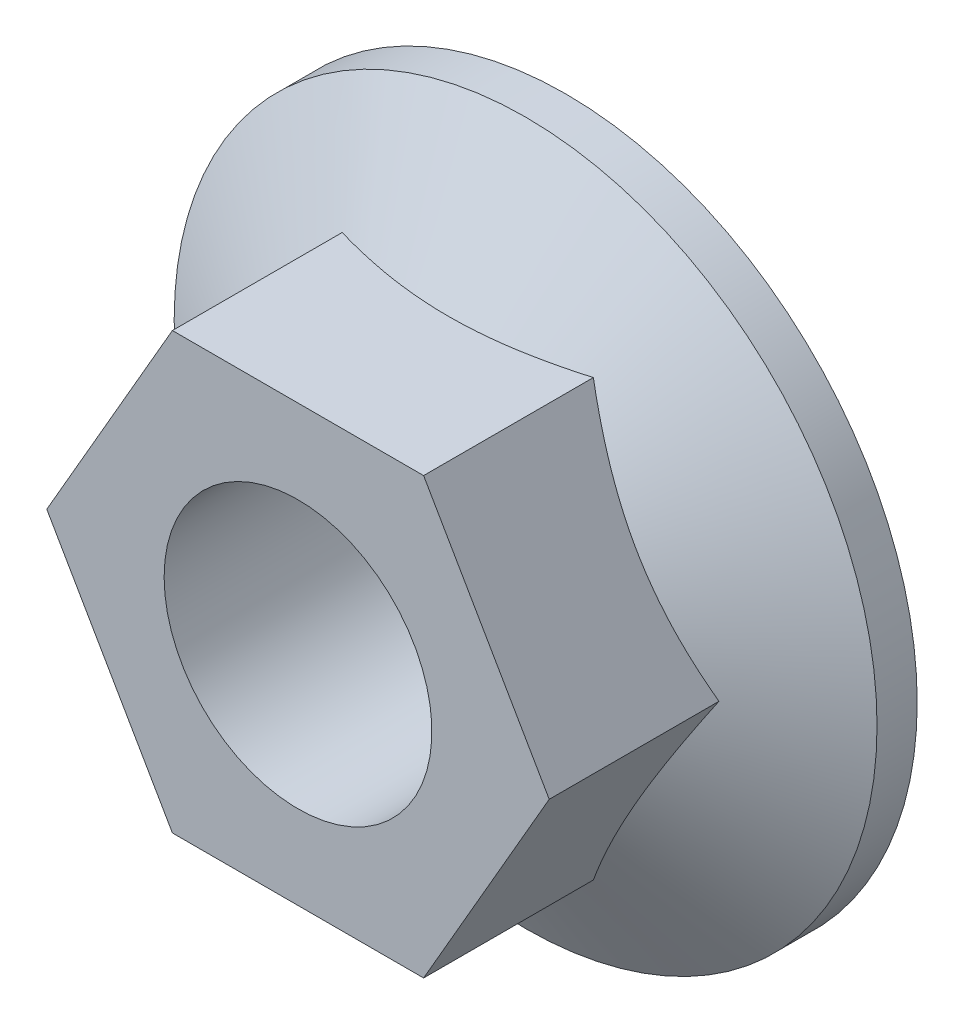
ISO-10303-21;
HEADER;
FILE_DESCRIPTION(('STEP AP214'),'2;1');
FILE_NAME('part.step','',(''),(''),'','','');
FILE_SCHEMA(('AUTOMOTIVE_DESIGN { 1 0 10303 214 1 1 1 1 }'));
ENDSEC;
DATA;
#1=APPLICATION_CONTEXT('core data for automotive mechanical design processes');
#2=APPLICATION_PROTOCOL_DEFINITION('international standard','automotive_design',2000,#1);
#3=PRODUCT_CONTEXT('',#1,'mechanical');
#4=PRODUCT('Part','Part','',(#3));
#5=PRODUCT_RELATED_PRODUCT_CATEGORY('part','',(#4));
#6=PRODUCT_DEFINITION_FORMATION('','',#4);
#7=PRODUCT_DEFINITION_CONTEXT('part definition',#1,'design');
#8=PRODUCT_DEFINITION('design','',#6,#7);
#9=PRODUCT_DEFINITION_SHAPE('','',#8);
#10=(LENGTH_UNIT() NAMED_UNIT(*) SI_UNIT(.MILLI.,.METRE.));
#11=(NAMED_UNIT(*) PLANE_ANGLE_UNIT() SI_UNIT($,.RADIAN.));
#12=(NAMED_UNIT(*) SI_UNIT($,.STERADIAN.) SOLID_ANGLE_UNIT());
#13=UNCERTAINTY_MEASURE_WITH_UNIT(LENGTH_MEASURE(1.E-05),#10,'distance_accuracy_value','');
#14=(GEOMETRIC_REPRESENTATION_CONTEXT(3) GLOBAL_UNCERTAINTY_ASSIGNED_CONTEXT((#13)) GLOBAL_UNIT_ASSIGNED_CONTEXT((#10,
#11,#12)) REPRESENTATION_CONTEXT('',''));
#15=CARTESIAN_POINT('',(0.,0.,0.));
#16=DIRECTION('',(0.,0.,1.));
#17=DIRECTION('',(1.,0.,0.));
#18=AXIS2_PLACEMENT_3D('',#15,#16,#17);
#19=CARTESIAN_POINT('',(-7.69319233695161,-0.325000000000484,8.2535577753421));
#20=DIRECTION('',(-0.866025403784461,0.499999999999961,0.));
#21=DIRECTION('',(0.,0.,1.));
#22=AXIS2_PLACEMENT_3D('',#19,#20,#21);
#23=PLANE('',#22);
#24=DIRECTION('',(0.,0.,-1.));
#25=VECTOR('',#24,1.);
#26=CARTESIAN_POINT('',(-3.75277674973342,6.49999999999976,8.));
#27=LINE('',#26,#25);
#28=CARTESIAN_POINT('',(-3.75277674973342,6.49999999999976,8.));
#29=VERTEX_POINT('',#28);
#30=CARTESIAN_POINT('',(-3.75277674973342,6.49999999999976,2.928844493158));
#31=VERTEX_POINT('',#30);
#32=EDGE_CURVE('E11',#29,#31,#27,.T.);
#33=ORIENTED_EDGE('',*,*,#32,.T.);
#34=CARTESIAN_POINT('',(-3.75277674973287,6.49999999999944,2.928844493158));
#35=CARTESIAN_POINT('',(-4.25519027136094,5.62979425412992,3.21891307511255));
#36=CARTESIAN_POINT('',(-4.70764700601063,4.84611620148987,3.3614471829164));
#37=CARTESIAN_POINT('',(-5.17712493961072,4.03295656746199,3.50934335347754));
#38=CARTESIAN_POINT('',(-5.62916551508448,3.24999932365868,3.5093859456862));
#39=CARTESIAN_POINT('',(-6.08068412274653,2.46794615462516,3.50942848871397));
#40=CARTESIAN_POINT('',(-6.55068458913403,1.65388146726086,3.36144678727725));
#41=CARTESIAN_POINT('',(-7.00284985851243,0.870708247279326,3.21908057558494));
#42=CARTESIAN_POINT('',(-7.505553499465,-4.86644145120119E-13,2.928844493158));
#43=B_SPLINE_CURVE_WITH_KNOTS('',2,(#34,#35,#36,#37,#38,#39,#40,#41,#42),.UNSPECIFIED.,.F.,.F.,
(3,2,2,2,3),(0.,0.25,0.5,0.75,1.),.UNSPECIFIED.);
#44=CARTESIAN_POINT('',(-7.505553499465,-4.88124996424892E-13,2.928844493158));
#45=VERTEX_POINT('',#44);
#46=EDGE_CURVE('E252',#31,#45,#43,.T.);
#47=ORIENTED_EDGE('',*,*,#46,.T.);
#48=DIRECTION('',(0.,0.,-1.));
#49=VECTOR('',#48,1.);
#50=CARTESIAN_POINT('',(-7.505553499465,-4.87814487950439E-13,8.));
#51=LINE('',#50,#49);
#52=CARTESIAN_POINT('',(-7.505553499465,-4.87814487950439E-13,8.));
#53=VERTEX_POINT('',#52);
#54=EDGE_CURVE('E103',#53,#45,#51,.T.);
#55=ORIENTED_EDGE('',*,*,#54,.F.);
#56=DIRECTION('',(0.499999999999887,0.866025403784504,0.));
#57=VECTOR('',#56,1.);
#58=CARTESIAN_POINT('',(-7.505553499465,-4.87814487950439E-13,8.));
#59=LINE('',#58,#57);
#60=EDGE_CURVE('E107',#53,#29,#59,.T.);
#61=ORIENTED_EDGE('',*,*,#60,.T.);
#62=EDGE_LOOP('',(#33,#47,#55,#61));
#63=FACE_BOUND('',#62,.T.);
#64=ADVANCED_FACE('F17',(#63),#23,.T.);
#65=CARTESIAN_POINT('',(-4.12805442470672,6.49999999999973,8.2535577753421));
#66=DIRECTION('',(0.,1.,0.));
#67=DIRECTION('',(1.,0.,0.));
#68=AXIS2_PLACEMENT_3D('',#65,#66,#67);
#69=PLANE('',#68);
#70=DIRECTION('',(0.,0.,-1.));
#71=VECTOR('',#70,1.);
#72=CARTESIAN_POINT('',(3.75277674973258,6.50000000000024,8.));
#73=LINE('',#72,#71);
#74=CARTESIAN_POINT('',(3.75277674973258,6.50000000000024,8.));
#75=VERTEX_POINT('',#74);
#76=CARTESIAN_POINT('',(3.75277674973258,6.50000000000024,2.928844493158));
#77=VERTEX_POINT('',#76);
#78=EDGE_CURVE('E31',#75,#77,#73,.T.);
#79=ORIENTED_EDGE('',*,*,#78,.T.);
#80=CARTESIAN_POINT('',(3.75277674973258,6.50000000000024,2.928844493158));
#81=CARTESIAN_POINT('',(2.74794927567332,6.50000000000018,3.21891319947502));
#82=CARTESIAN_POINT('',(1.84303567592422,6.50000000000012,3.36144726382099));
#83=CARTESIAN_POINT('',(0.903809546080359,6.50000000000006,3.50938593737357));
#84=CARTESIAN_POINT('',(-4.30211422042248E-13,6.5,3.50938593842317));
#85=B_SPLINE_CURVE_WITH_KNOTS('',2,(#80,#81,#82,#83,#84),.UNSPECIFIED.,.F.,.F.,(3,2,3),(0.,0.5,
1.),.UNSPECIFIED.);
#86=CARTESIAN_POINT('',(-4.13110435976821E-13,6.5,3.50940106915116));
#87=VERTEX_POINT('',#86);
#88=EDGE_CURVE('E265',#77,#87,#85,.T.);
#89=ORIENTED_EDGE('',*,*,#88,.T.);
#90=CARTESIAN_POINT('',(-4.30211422042248E-13,6.5,3.50938593842317));
#91=CARTESIAN_POINT('',(-0.90330560752237,6.49999999999994,3.50938593947218));
#92=CARTESIAN_POINT('',(-1.84303487596856,6.49999999999988,3.36144739456328));
#93=CARTESIAN_POINT('',(-2.74736684883211,6.49999999999982,3.2190813316213));
#94=CARTESIAN_POINT('',(-3.75277674973342,6.49999999999975,2.928844493158));
#95=B_SPLINE_CURVE_WITH_KNOTS('',2,(#90,#91,#92,#93,#94),.UNSPECIFIED.,.F.,.F.,(3,2,3),(0.,0.5,
1.),.UNSPECIFIED.);
#96=EDGE_CURVE('E257',#87,#31,#95,.T.);
#97=ORIENTED_EDGE('',*,*,#96,.T.);
#98=ORIENTED_EDGE('',*,*,#32,.F.);
#99=DIRECTION('',(1.,0.,0.));
#100=VECTOR('',#99,1.);
#101=CARTESIAN_POINT('',(-3.75277674973342,6.49999999999976,8.));
#102=LINE('',#101,#100);
#103=EDGE_CURVE('E90',#29,#75,#102,.T.);
#104=ORIENTED_EDGE('',*,*,#103,.T.);
#105=EDGE_LOOP('',(#79,#89,#97,#98,#104));
#106=FACE_BOUND('',#105,.T.);
#107=ADVANCED_FACE('F149',(#106),#69,.T.);
#108=CARTESIAN_POINT('',(3.56513791224593,6.82500000000022,8.2535577753421));
#109=DIRECTION('',(0.866025403784396,0.500000000000073,0.));
#110=DIRECTION('',(0.,0.,-1.));
#111=AXIS2_PLACEMENT_3D('',#108,#109,#110);
#112=PLANE('',#111);
#113=DIRECTION('',(0.,0.,-1.));
#114=VECTOR('',#113,1.);
#115=CARTESIAN_POINT('',(7.505553499465,4.88794173070438E-13,8.));
#116=LINE('',#115,#114);
#117=CARTESIAN_POINT('',(7.505553499465,4.88794173070438E-13,8.));
#118=VERTEX_POINT('',#117);
#119=CARTESIAN_POINT('',(7.505553499465,4.88483664595985E-13,2.928844493158));
#120=VERTEX_POINT('',#119);
#121=EDGE_CURVE('E355',#118,#120,#116,.T.);
#122=ORIENTED_EDGE('',*,*,#121,.T.);
#123=CARTESIAN_POINT('',(7.50555349946556,8.10115863281169E-13,2.928844493158));
#124=CARTESIAN_POINT('',(7.00314053124934,0.870204787332617,3.2189127556004));
#125=CARTESIAN_POINT('',(6.55068391641673,1.65388263244317,3.36144699833052));
#126=CARTESIAN_POINT('',(6.08120648335397,2.46704139951472,3.50934319037811));
#127=CARTESIAN_POINT('',(5.62916579924058,3.24999883148715,3.50938594638627));
#128=CARTESIAN_POINT('',(5.17764828074596,4.0320501140271,3.5094286529111));
#129=CARTESIAN_POINT('',(4.70764857465841,4.84611348451301,3.36144768267794));
#130=CARTESIAN_POINT('',(4.25548210837812,5.62928877758921,3.21908156729445));
#131=CARTESIAN_POINT('',(3.75277674973258,6.50000000000024,2.928844493158));
#132=B_SPLINE_CURVE_WITH_KNOTS('',2,(#123,#124,#125,#126,#127,#128,#129,#130,#131),
.UNSPECIFIED.,.F.,.F.,(3,2,2,2,3),(0.,0.25,0.5,0.75,1.),.UNSPECIFIED.);
#133=EDGE_CURVE('E273',#120,#77,#132,.T.);
#134=ORIENTED_EDGE('',*,*,#133,.T.);
#135=ORIENTED_EDGE('',*,*,#78,.F.);
#136=DIRECTION('',(0.5,-0.866025403784439,0.));
#137=VECTOR('',#136,1.);
#138=CARTESIAN_POINT('',(3.75277674973258,6.50000000000024,8.));
#139=LINE('',#138,#137);
#140=EDGE_CURVE('E98',#75,#118,#139,.T.);
#141=ORIENTED_EDGE('',*,*,#140,.T.);
#142=EDGE_LOOP('',(#122,#134,#135,#141));
#143=FACE_BOUND('',#142,.T.);
#144=ADVANCED_FACE('F19',(#143),#112,.T.);
#145=CARTESIAN_POINT('',(7.69319233695161,0.325000000000485,8.2535577753421));
#146=DIRECTION('',(0.866025403784461,-0.499999999999961,0.));
#147=DIRECTION('',(0.,0.,-1.));
#148=AXIS2_PLACEMENT_3D('',#145,#146,#147);
#149=PLANE('',#148);
#150=DIRECTION('',(0.,0.,-1.));
#151=VECTOR('',#150,1.);
#152=CARTESIAN_POINT('',(3.75277674973342,-6.49999999999976,8.));
#153=LINE('',#152,#151);
#154=CARTESIAN_POINT('',(3.75277674973342,-6.49999999999976,8.));
#155=VERTEX_POINT('',#154);
#156=CARTESIAN_POINT('',(3.75277674973342,-6.49999999999976,2.928844493158));
#157=VERTEX_POINT('',#156);
#158=EDGE_CURVE('E171',#155,#157,#153,.T.);
#159=ORIENTED_EDGE('',*,*,#158,.T.);
#160=CARTESIAN_POINT('',(3.75277674973287,-6.49999999999944,2.928844493158));
#161=CARTESIAN_POINT('',(4.25519027136138,-5.62979425412916,3.2189130751128));
#162=CARTESIAN_POINT('',(4.70764700601063,-4.84611620148987,3.3614471829164));
#163=CARTESIAN_POINT('',(5.1771249396111,-4.03295656746133,3.50934335347754));
#164=CARTESIAN_POINT('',(5.62916551508448,-3.24999932365868,3.5093859456862));
#165=CARTESIAN_POINT('',(6.08068412274672,-2.46794615462483,3.50942848871397));
#166=CARTESIAN_POINT('',(6.55068458913403,-1.65388146726086,3.36144678727725));
#167=CARTESIAN_POINT('',(7.00284985851265,-0.870708247278942,3.21908057558482));
#168=CARTESIAN_POINT('',(7.505553499465,4.87348876532234E-13,2.928844493158));
#169=B_SPLINE_CURVE_WITH_KNOTS('',2,(#160,#161,#162,#163,#164,#165,#166,#167,#168),
.UNSPECIFIED.,.F.,.F.,(3,2,2,2,3),(0.,0.25,0.5,0.75,1.),.UNSPECIFIED.);
#170=EDGE_CURVE('E279',#157,#120,#169,.T.);
#171=ORIENTED_EDGE('',*,*,#170,.T.);
#172=ORIENTED_EDGE('',*,*,#121,.F.);
#173=DIRECTION('',(-0.499999999999887,-0.866025403784504,0.));
#174=VECTOR('',#173,1.);
#175=CARTESIAN_POINT('',(7.505553499465,4.88794173070438E-13,8.));
#176=LINE('',#175,#174);
#177=EDGE_CURVE('E113',#118,#155,#176,.T.);
#178=ORIENTED_EDGE('',*,*,#177,.T.);
#179=EDGE_LOOP('',(#159,#171,#172,#178));
#180=FACE_BOUND('',#179,.T.);
#181=ADVANCED_FACE('F148',(#180),#149,.T.);
#182=CARTESIAN_POINT('',(4.12805442470672,-6.49999999999973,8.2535577753421));
#183=DIRECTION('',(0.,-1.,0.));
#184=DIRECTION('',(0.,0.,-1.));
#185=AXIS2_PLACEMENT_3D('',#182,#183,#184);
#186=PLANE('',#185);
#187=DIRECTION('',(0.,0.,-1.));
#188=VECTOR('',#187,1.);
#189=CARTESIAN_POINT('',(-3.75277674973258,-6.50000000000024,8.));
#190=LINE('',#189,#188);
#191=CARTESIAN_POINT('',(-3.75277674973258,-6.50000000000024,8.));
#192=VERTEX_POINT('',#191);
#193=CARTESIAN_POINT('',(-3.75277674973258,-6.50000000000024,2.928844493158));
#194=VERTEX_POINT('',#193);
#195=EDGE_CURVE('E232',#192,#194,#190,.T.);
#196=ORIENTED_EDGE('',*,*,#195,.T.);
#197=CARTESIAN_POINT('',(-3.75277674973258,-6.50000000000024,2.928844493158));
#198=CARTESIAN_POINT('',(-2.74794927567332,-6.50000000000018,3.21891319947502));
#199=CARTESIAN_POINT('',(-1.84303567592422,-6.50000000000012,3.36144726382099));
#200=CARTESIAN_POINT('',(-0.903809546080359,-6.50000000000006,3.50938593737357));
#201=CARTESIAN_POINT('',(4.30211422042248E-13,-6.5,3.50938593842317));
#202=B_SPLINE_CURVE_WITH_KNOTS('',2,(#197,#198,#199,#200,#201),.UNSPECIFIED.,.F.,.F.,(3,2,3),
(0.,0.5,1.),.UNSPECIFIED.);
#203=CARTESIAN_POINT('',(4.13110460610432E-13,-6.5,3.50940106915116));
#204=VERTEX_POINT('',#203);
#205=EDGE_CURVE('E108',#194,#204,#202,.T.);
#206=ORIENTED_EDGE('',*,*,#205,.T.);
#207=CARTESIAN_POINT('',(4.30211422042248E-13,-6.5,3.50938593842317));
#208=CARTESIAN_POINT('',(0.90330560752237,-6.49999999999994,3.50938593947218));
#209=CARTESIAN_POINT('',(1.84303487596856,-6.49999999999988,3.36144739456328));
#210=CARTESIAN_POINT('',(2.74736684883211,-6.49999999999982,3.2190813316213));
#211=CARTESIAN_POINT('',(3.75277674973342,-6.49999999999975,2.928844493158));
#212=B_SPLINE_CURVE_WITH_KNOTS('',2,(#207,#208,#209,#210,#211),.UNSPECIFIED.,.F.,.F.,(3,2,3),
(0.,0.5,1.),.UNSPECIFIED.);
#213=EDGE_CURVE('E167',#204,#157,#212,.T.);
#214=ORIENTED_EDGE('',*,*,#213,.T.);
#215=ORIENTED_EDGE('',*,*,#158,.F.);
#216=DIRECTION('',(-1.,0.,0.));
#217=VECTOR('',#216,1.);
#218=CARTESIAN_POINT('',(3.75277674973342,-6.49999999999976,8.));
#219=LINE('',#218,#217);
#220=EDGE_CURVE('E109',#155,#192,#219,.T.);
#221=ORIENTED_EDGE('',*,*,#220,.T.);
#222=EDGE_LOOP('',(#196,#206,#214,#215,#221));
#223=FACE_BOUND('',#222,.T.);
#224=ADVANCED_FACE('F138',(#223),#186,.T.);
#225=CARTESIAN_POINT('',(-3.56513791224593,-6.82500000000022,8.2535577753421));
#226=DIRECTION('',(-0.866025403784396,-0.500000000000073,0.));
#227=DIRECTION('',(-0.500000000000073,0.866025403784396,0.));
#228=AXIS2_PLACEMENT_3D('',#225,#226,#227);
#229=PLANE('',#228);
#230=ORIENTED_EDGE('',*,*,#54,.T.);
#231=CARTESIAN_POINT('',(-7.50555349946556,-8.10115863281169E-13,2.928844493158));
#232=CARTESIAN_POINT('',(-7.0031405312489,-0.870204787333371,3.21891275560065));
#233=CARTESIAN_POINT('',(-6.55068391641673,-1.65388263244317,3.36144699833052));
#234=CARTESIAN_POINT('',(-6.08120648335359,-2.46704139951538,3.50934319037811));
#235=CARTESIAN_POINT('',(-5.62916579924058,-3.24999883148715,3.50938594638627));
#236=CARTESIAN_POINT('',(-5.17764828074615,-4.03205011402678,3.5094286529111));
#237=CARTESIAN_POINT('',(-4.70764857465841,-4.84611348451302,3.36144768267794));
#238=CARTESIAN_POINT('',(-4.25548210837834,-5.62928877758883,3.21908156729458));
#239=CARTESIAN_POINT('',(-3.75277674973258,-6.50000000000024,2.928844493158));
#240=B_SPLINE_CURVE_WITH_KNOTS('',2,(#231,#232,#233,#234,#235,#236,#237,#238,#239),
.UNSPECIFIED.,.F.,.F.,(3,2,2,2,3),(0.,0.25,0.5,0.75,1.),.UNSPECIFIED.);
#241=EDGE_CURVE('E241',#45,#194,#240,.T.);
#242=ORIENTED_EDGE('',*,*,#241,.T.);
#243=ORIENTED_EDGE('',*,*,#195,.F.);
#244=DIRECTION('',(-0.5,0.866025403784439,0.));
#245=VECTOR('',#244,1.);
#246=CARTESIAN_POINT('',(-3.75277674973258,-6.50000000000024,8.));
#247=LINE('',#246,#245);
#248=EDGE_CURVE('E114',#192,#53,#247,.T.);
#249=ORIENTED_EDGE('',*,*,#248,.T.);
#250=EDGE_LOOP('',(#230,#242,#243,#249));
#251=FACE_BOUND('',#250,.T.);
#252=ADVANCED_FACE('F147',(#251),#229,.T.);
#253=CARTESIAN_POINT('',(0.,0.,8.4));
#254=DIRECTION('',(0.,0.,1.));
#255=DIRECTION('',(-1.,0.,0.));
#256=AXIS2_PLACEMENT_3D('',#253,#254,#255);
#257=CYLINDRICAL_SURFACE('',#256,10.5);
#258=CARTESIAN_POINT('',(0.,0.,0.));
#259=DIRECTION('',(0.,0.,1.));
#260=DIRECTION('',(1.,0.,0.));
#261=AXIS2_PLACEMENT_3D('',#258,#259,#260);
#262=CIRCLE('',#261,10.5);
#263=CARTESIAN_POINT('',(-10.5,-6.83120235E-13,0.));
#264=VERTEX_POINT('',#263);
#265=EDGE_CURVE('E43',#264,#264,#262,.T.);
#266=ORIENTED_EDGE('',*,*,#265,.T.);
#267=EDGE_LOOP('',(#266));
#268=FACE_BOUND('',#267,.T.);
#269=CARTESIAN_POINT('',(0.,0.,1.2));
#270=DIRECTION('',(0.,0.,-1.));
#271=DIRECTION('',(1.,0.,0.));
#272=AXIS2_PLACEMENT_3D('',#269,#270,#271);
#273=CIRCLE('',#272,10.5);
#274=CARTESIAN_POINT('',(-10.5,-6.83046758616E-13,1.2));
#275=VERTEX_POINT('',#274);
#276=EDGE_CURVE('E104',#275,#275,#273,.T.);
#277=ORIENTED_EDGE('',*,*,#276,.T.);
#278=EDGE_LOOP('',(#277));
#279=FACE_BOUND('',#278,.T.);
#280=ADVANCED_FACE('F308',(#268,#279),#257,.T.);
#281=CARTESIAN_POINT('',(11.5500000000008,-11.5499999999992,0.));
#282=DIRECTION('',(0.,0.,-1.));
#283=DIRECTION('',(0.,-1.,0.));
#284=AXIS2_PLACEMENT_3D('',#281,#282,#283);
#285=PLANE('',#284);
#286=CARTESIAN_POINT('',(0.,0.,0.));
#287=DIRECTION('',(0.,0.,-1.));
#288=DIRECTION('',(1.,0.,0.));
#289=AXIS2_PLACEMENT_3D('',#286,#287,#288);
#290=CIRCLE('',#289,4.);
#291=CARTESIAN_POINT('',(-4.,-2.6023628E-13,0.));
#292=VERTEX_POINT('',#291);
#293=EDGE_CURVE('E89',#292,#292,#290,.T.);
#294=ORIENTED_EDGE('',*,*,#293,.F.);
#295=EDGE_LOOP('',(#294));
#296=FACE_BOUND('',#295,.T.);
#297=ORIENTED_EDGE('',*,*,#265,.F.);
#298=EDGE_LOOP('',(#297));
#299=FACE_BOUND('',#298,.T.);
#300=ADVANCED_FACE('F307',(#296,#299),#285,.T.);
#301=CARTESIAN_POINT('',(0.,0.,8.4));
#302=DIRECTION('',(0.,0.,1.));
#303=DIRECTION('',(-1.,0.,0.));
#304=AXIS2_PLACEMENT_3D('',#301,#302,#303);
#305=CYLINDRICAL_SURFACE('',#304,4.);
#306=CARTESIAN_POINT('',(0.,0.,8.));
#307=DIRECTION('',(0.,0.,1.));
#308=DIRECTION('',(1.,0.,0.));
#309=AXIS2_PLACEMENT_3D('',#306,#307,#308);
#310=CIRCLE('',#309,4.);
#311=CARTESIAN_POINT('',(-4.,-2.5974643744E-13,8.));
#312=VERTEX_POINT('',#311);
#313=EDGE_CURVE('E84',#312,#312,#310,.T.);
#314=ORIENTED_EDGE('',*,*,#313,.T.);
#315=EDGE_LOOP('',(#314));
#316=FACE_BOUND('',#315,.T.);
#317=ORIENTED_EDGE('',*,*,#293,.T.);
#318=EDGE_LOOP('',(#317));
#319=FACE_BOUND('',#318,.T.);
#320=ADVANCED_FACE('F85',(#316,#319),#305,.F.);
#321=CARTESIAN_POINT('',(8.25610884941257,-7.14999999999946,8.));
#322=DIRECTION('',(0.,0.,-1.));
#323=DIRECTION('',(0.,-1.,0.));
#324=AXIS2_PLACEMENT_3D('',#321,#322,#323);
#325=PLANE('',#324);
#326=ORIENTED_EDGE('',*,*,#313,.F.);
#327=EDGE_LOOP('',(#326));
#328=FACE_BOUND('',#327,.T.);
#329=ORIENTED_EDGE('',*,*,#60,.F.);
#330=ORIENTED_EDGE('',*,*,#248,.F.);
#331=ORIENTED_EDGE('',*,*,#220,.F.);
#332=ORIENTED_EDGE('',*,*,#177,.F.);
#333=ORIENTED_EDGE('',*,*,#140,.F.);
#334=ORIENTED_EDGE('',*,*,#103,.F.);
#335=EDGE_LOOP('',(#329,#330,#331,#332,#333,#334));
#336=FACE_BOUND('',#335,.T.);
#337=ADVANCED_FACE('F183',(#328,#336),#325,.F.);
#338=CARTESIAN_POINT('',(0.,0.,6.26217782649082));
#339=DIRECTION('',(0.,0.,-1.));
#340=DIRECTION('',(0.,-1.,0.));
#341=AXIS2_PLACEMENT_3D('',#338,#339,#340);
#342=CONICAL_SURFACE('',#341,1.73205080756888,1.04719755);
#343=ORIENTED_EDGE('',*,*,#276,.F.);
#344=EDGE_LOOP('',(#343));
#345=FACE_BOUND('',#344,.T.);
#346=ORIENTED_EDGE('',*,*,#241,.F.);
#347=ORIENTED_EDGE('',*,*,#46,.F.);
#348=ORIENTED_EDGE('',*,*,#96,.F.);
#349=ORIENTED_EDGE('',*,*,#88,.F.);
#350=ORIENTED_EDGE('',*,*,#133,.F.);
#351=ORIENTED_EDGE('',*,*,#170,.F.);
#352=ORIENTED_EDGE('',*,*,#213,.F.);
#353=ORIENTED_EDGE('',*,*,#205,.F.);
#354=EDGE_LOOP('',(#346,#347,#348,#349,#350,#351,#352,#353));
#355=FACE_BOUND('',#354,.T.);
#356=ADVANCED_FACE('F173',(#345,#355),#342,.T.);
#357=CLOSED_SHELL('',(#64,#107,#144,#181,#224,#252,#280,#300,#320,#337,#356));
#358=MANIFOLD_SOLID_BREP('B1',#357);
#359=ADVANCED_BREP_SHAPE_REPRESENTATION('',(#18,#358),#14);
#360=SHAPE_DEFINITION_REPRESENTATION(#9,#359);
ENDSEC;
END-ISO-10303-21;
